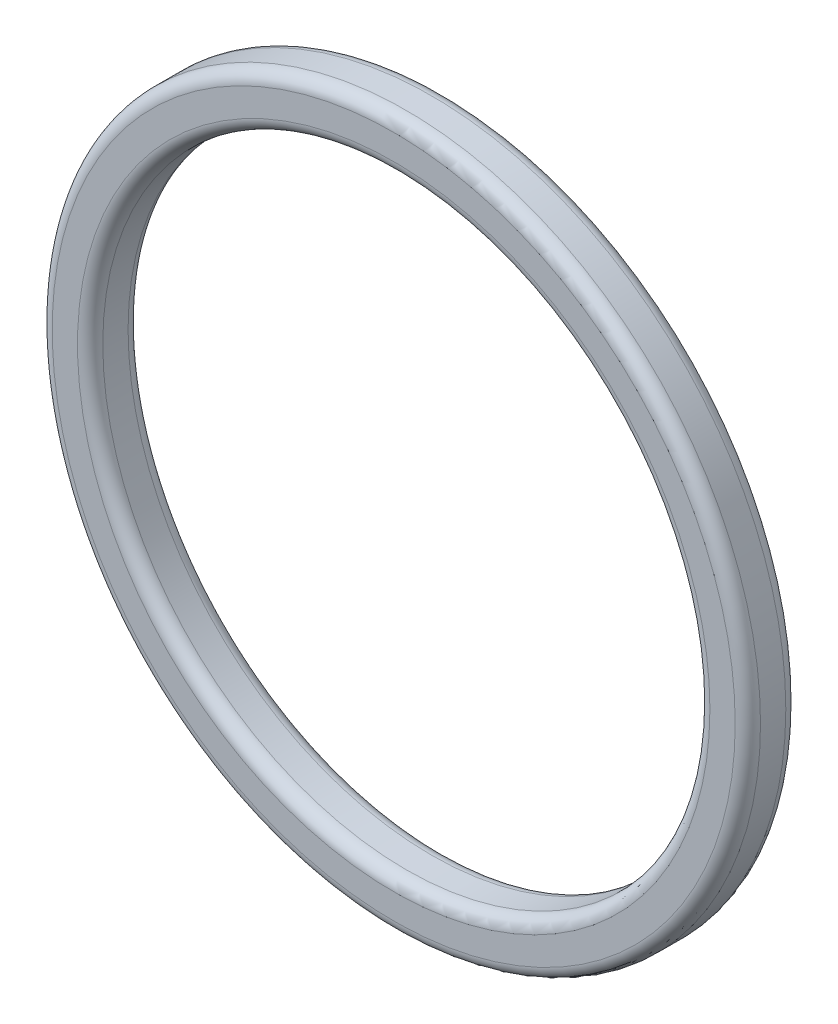
ISO-10303-21;
HEADER;
FILE_DESCRIPTION(('STEP AP214'),'2;1');
FILE_NAME('part.step','',(''),(''),'','','');
FILE_SCHEMA(('AUTOMOTIVE_DESIGN { 1 0 10303 214 1 1 1 1 }'));
ENDSEC;
DATA;
#1=APPLICATION_CONTEXT('core data for automotive mechanical design processes');
#2=APPLICATION_PROTOCOL_DEFINITION('international standard','automotive_design',2000,#1);
#3=PRODUCT_CONTEXT('',#1,'mechanical');
#4=PRODUCT('Part','Part','',(#3));
#5=PRODUCT_RELATED_PRODUCT_CATEGORY('part','',(#4));
#6=PRODUCT_DEFINITION_FORMATION('','',#4);
#7=PRODUCT_DEFINITION_CONTEXT('part definition',#1,'design');
#8=PRODUCT_DEFINITION('design','',#6,#7);
#9=PRODUCT_DEFINITION_SHAPE('','',#8);
#10=(LENGTH_UNIT() NAMED_UNIT(*) SI_UNIT(.MILLI.,.METRE.));
#11=(NAMED_UNIT(*) PLANE_ANGLE_UNIT() SI_UNIT($,.RADIAN.));
#12=(NAMED_UNIT(*) SI_UNIT($,.STERADIAN.) SOLID_ANGLE_UNIT());
#13=UNCERTAINTY_MEASURE_WITH_UNIT(LENGTH_MEASURE(1.E-05),#10,'distance_accuracy_value','');
#14=(GEOMETRIC_REPRESENTATION_CONTEXT(3) GLOBAL_UNCERTAINTY_ASSIGNED_CONTEXT((#13)) GLOBAL_UNIT_ASSIGNED_CONTEXT((#10,
#11,#12)) REPRESENTATION_CONTEXT('',''));
#15=CARTESIAN_POINT('',(0.,0.,0.));
#16=DIRECTION('',(0.,0.,1.));
#17=DIRECTION('',(1.,0.,0.));
#18=AXIS2_PLACEMENT_3D('',#15,#16,#17);
#19=CARTESIAN_POINT('',(0.,0.,1.));
#20=DIRECTION('',(0.,0.,1.));
#21=DIRECTION('',(1.,0.,0.));
#22=AXIS2_PLACEMENT_3D('',#19,#20,#21);
#23=PLANE('',#22);
#24=CARTESIAN_POINT('',(0.,0.,1.));
#25=DIRECTION('',(0.,0.,1.));
#26=DIRECTION('',(1.,0.,0.));
#27=AXIS2_PLACEMENT_3D('',#24,#25,#26);
#28=CIRCLE('',#27,6.25);
#29=CARTESIAN_POINT('',(6.25,0.,1.));
#30=VERTEX_POINT('',#29);
#31=EDGE_CURVE('E45',#30,#30,#28,.F.);
#32=ORIENTED_EDGE('',*,*,#31,.T.);
#33=EDGE_LOOP('',(#32));
#34=FACE_BOUND('',#33,.T.);
#35=CARTESIAN_POINT('',(0.,0.,1.));
#36=DIRECTION('',(0.,0.,1.));
#37=DIRECTION('',(1.,0.,0.));
#38=AXIS2_PLACEMENT_3D('',#35,#36,#37);
#39=CIRCLE('',#38,6.75);
#40=CARTESIAN_POINT('',(6.75,0.,1.));
#41=VERTEX_POINT('',#40);
#42=EDGE_CURVE('E50',#41,#41,#39,.T.);
#43=ORIENTED_EDGE('',*,*,#42,.T.);
#44=EDGE_LOOP('',(#43));
#45=FACE_BOUND('',#44,.T.);
#46=ADVANCED_FACE('F37',(#34,#45),#23,.T.);
#47=CARTESIAN_POINT('',(0.,0.,0.));
#48=DIRECTION('',(0.,0.,1.));
#49=DIRECTION('',(1.,0.,0.));
#50=AXIS2_PLACEMENT_3D('',#47,#48,#49);
#51=PLANE('',#50);
#52=CARTESIAN_POINT('',(0.,0.,0.));
#53=DIRECTION('',(0.,0.,1.));
#54=DIRECTION('',(1.,0.,0.));
#55=AXIS2_PLACEMENT_3D('',#52,#53,#54);
#56=CIRCLE('',#55,6.25);
#57=CARTESIAN_POINT('',(6.25,0.,0.));
#58=VERTEX_POINT('',#57);
#59=EDGE_CURVE('E69',#58,#58,#56,.T.);
#60=ORIENTED_EDGE('',*,*,#59,.T.);
#61=EDGE_LOOP('',(#60));
#62=FACE_BOUND('',#61,.T.);
#63=CARTESIAN_POINT('',(0.,0.,0.));
#64=DIRECTION('',(0.,0.,1.));
#65=DIRECTION('',(1.,0.,0.));
#66=AXIS2_PLACEMENT_3D('',#63,#64,#65);
#67=CIRCLE('',#66,6.75);
#68=CARTESIAN_POINT('',(6.75,0.,0.));
#69=VERTEX_POINT('',#68);
#70=EDGE_CURVE('E73',#69,#69,#67,.F.);
#71=ORIENTED_EDGE('',*,*,#70,.T.);
#72=EDGE_LOOP('',(#71));
#73=FACE_BOUND('',#72,.T.);
#74=ADVANCED_FACE('F78',(#62,#73),#51,.F.);
#75=CARTESIAN_POINT('',(0.,0.,1.));
#76=DIRECTION('',(0.,0.,-1.));
#77=DIRECTION('',(-1.,0.,0.));
#78=AXIS2_PLACEMENT_3D('',#75,#76,#77);
#79=CYLINDRICAL_SURFACE('',#78,7.);
#80=CARTESIAN_POINT('',(0.,0.,0.75));
#81=DIRECTION('',(0.,0.,1.));
#82=DIRECTION('',(1.,0.,0.));
#83=AXIS2_PLACEMENT_3D('',#80,#81,#82);
#84=CIRCLE('',#83,7.);
#85=CARTESIAN_POINT('',(7.,0.,0.75));
#86=VERTEX_POINT('',#85);
#87=EDGE_CURVE('E10',#86,#86,#84,.F.);
#88=ORIENTED_EDGE('',*,*,#87,.T.);
#89=EDGE_LOOP('',(#88));
#90=FACE_BOUND('',#89,.T.);
#91=CARTESIAN_POINT('',(0.,0.,0.25));
#92=DIRECTION('',(0.,0.,1.));
#93=DIRECTION('',(1.,0.,0.));
#94=AXIS2_PLACEMENT_3D('',#91,#92,#93);
#95=CIRCLE('',#94,7.);
#96=CARTESIAN_POINT('',(7.,0.,0.25));
#97=VERTEX_POINT('',#96);
#98=EDGE_CURVE('E61',#97,#97,#95,.T.);
#99=ORIENTED_EDGE('',*,*,#98,.T.);
#100=EDGE_LOOP('',(#99));
#101=FACE_BOUND('',#100,.T.);
#102=ADVANCED_FACE('F88',(#90,#101),#79,.T.);
#103=CARTESIAN_POINT('',(0.,0.,1.));
#104=DIRECTION('',(0.,0.,-1.));
#105=DIRECTION('',(-1.,0.,0.));
#106=AXIS2_PLACEMENT_3D('',#103,#104,#105);
#107=CYLINDRICAL_SURFACE('',#106,6.);
#108=CARTESIAN_POINT('',(0.,0.,0.75));
#109=DIRECTION('',(0.,0.,1.));
#110=DIRECTION('',(1.,0.,0.));
#111=AXIS2_PLACEMENT_3D('',#108,#109,#110);
#112=CIRCLE('',#111,6.);
#113=CARTESIAN_POINT('',(6.,0.,0.75));
#114=VERTEX_POINT('',#113);
#115=EDGE_CURVE('E55',#114,#114,#112,.T.);
#116=ORIENTED_EDGE('',*,*,#115,.T.);
#117=EDGE_LOOP('',(#116));
#118=FACE_BOUND('',#117,.T.);
#119=CARTESIAN_POINT('',(0.,0.,0.25));
#120=DIRECTION('',(0.,0.,1.));
#121=DIRECTION('',(1.,0.,0.));
#122=AXIS2_PLACEMENT_3D('',#119,#120,#121);
#123=CIRCLE('',#122,6.);
#124=CARTESIAN_POINT('',(6.,0.,0.25));
#125=VERTEX_POINT('',#124);
#126=EDGE_CURVE('E65',#125,#125,#123,.F.);
#127=ORIENTED_EDGE('',*,*,#126,.T.);
#128=EDGE_LOOP('',(#127));
#129=FACE_BOUND('',#128,.T.);
#130=ADVANCED_FACE('F90',(#118,#129),#107,.F.);
#131=CARTESIAN_POINT('',(0.,0.,0.25));
#132=DIRECTION('',(0.,0.,1.));
#133=DIRECTION('',(1.,0.,0.));
#134=AXIS2_PLACEMENT_3D('',#131,#132,#133);
#135=TOROIDAL_SURFACE('',#134,6.25,0.25);
#136=ORIENTED_EDGE('',*,*,#126,.F.);
#137=EDGE_LOOP('',(#136));
#138=FACE_BOUND('',#137,.T.);
#139=ORIENTED_EDGE('',*,*,#59,.F.);
#140=EDGE_LOOP('',(#139));
#141=FACE_BOUND('',#140,.T.);
#142=ADVANCED_FACE('F84',(#138,#141),#135,.T.);
#143=CARTESIAN_POINT('',(0.,0.,0.25));
#144=DIRECTION('',(0.,0.,1.));
#145=DIRECTION('',(1.,0.,0.));
#146=AXIS2_PLACEMENT_3D('',#143,#144,#145);
#147=TOROIDAL_SURFACE('',#146,6.75,0.25);
#148=ORIENTED_EDGE('',*,*,#70,.F.);
#149=EDGE_LOOP('',(#148));
#150=FACE_BOUND('',#149,.T.);
#151=ORIENTED_EDGE('',*,*,#98,.F.);
#152=EDGE_LOOP('',(#151));
#153=FACE_BOUND('',#152,.T.);
#154=ADVANCED_FACE('F80',(#150,#153),#147,.T.);
#155=CARTESIAN_POINT('',(0.,0.,0.75));
#156=DIRECTION('',(0.,0.,1.));
#157=DIRECTION('',(1.,0.,0.));
#158=AXIS2_PLACEMENT_3D('',#155,#156,#157);
#159=TOROIDAL_SURFACE('',#158,6.25,0.25);
#160=ORIENTED_EDGE('',*,*,#31,.F.);
#161=EDGE_LOOP('',(#160));
#162=FACE_BOUND('',#161,.T.);
#163=ORIENTED_EDGE('',*,*,#115,.F.);
#164=EDGE_LOOP('',(#163));
#165=FACE_BOUND('',#164,.T.);
#166=ADVANCED_FACE('F83',(#162,#165),#159,.T.);
#167=CARTESIAN_POINT('',(0.,0.,0.75));
#168=DIRECTION('',(0.,0.,1.));
#169=DIRECTION('',(1.,0.,0.));
#170=AXIS2_PLACEMENT_3D('',#167,#168,#169);
#171=TOROIDAL_SURFACE('',#170,6.75,0.25);
#172=ORIENTED_EDGE('',*,*,#87,.F.);
#173=EDGE_LOOP('',(#172));
#174=FACE_BOUND('',#173,.T.);
#175=ORIENTED_EDGE('',*,*,#42,.F.);
#176=EDGE_LOOP('',(#175));
#177=FACE_BOUND('',#176,.T.);
#178=ADVANCED_FACE('F39',(#174,#177),#171,.T.);
#179=CLOSED_SHELL('',(#46,#74,#102,#130,#142,#154,#166,#178));
#180=MANIFOLD_SOLID_BREP('B2',#179);
#181=ADVANCED_BREP_SHAPE_REPRESENTATION('',(#18,#180),#14);
#182=SHAPE_DEFINITION_REPRESENTATION(#9,#181);
ENDSEC;
END-ISO-10303-21;
